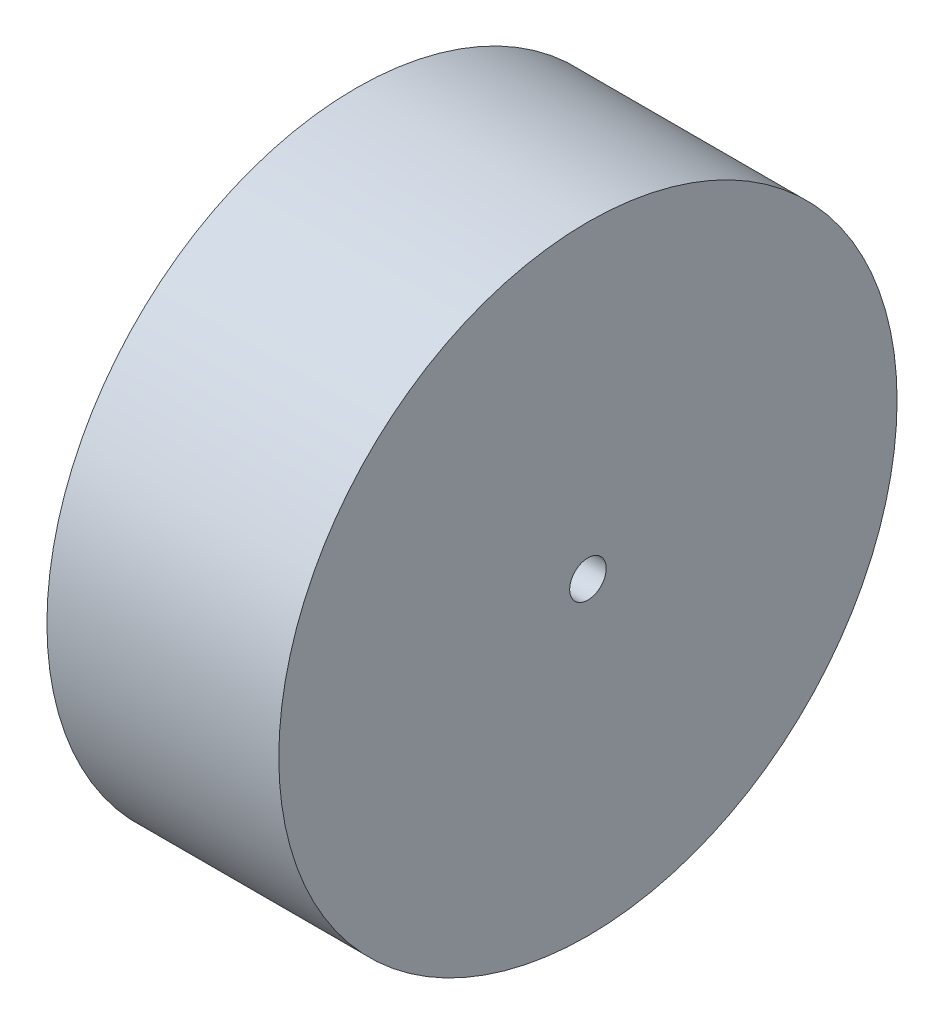
ISO-10303-21;
HEADER;
FILE_DESCRIPTION(('STEP AP214'),'2;1');
FILE_NAME('part.step','',(''),(''),'','','');
FILE_SCHEMA(('AUTOMOTIVE_DESIGN { 1 0 10303 214 1 1 1 1 }'));
ENDSEC;
DATA;
#1=APPLICATION_CONTEXT('core data for automotive mechanical design processes');
#2=APPLICATION_PROTOCOL_DEFINITION('international standard','automotive_design',2000,#1);
#3=PRODUCT_CONTEXT('',#1,'mechanical');
#4=PRODUCT('Part','Part','',(#3));
#5=PRODUCT_RELATED_PRODUCT_CATEGORY('part','',(#4));
#6=PRODUCT_DEFINITION_FORMATION('','',#4);
#7=PRODUCT_DEFINITION_CONTEXT('part definition',#1,'design');
#8=PRODUCT_DEFINITION('design','',#6,#7);
#9=PRODUCT_DEFINITION_SHAPE('','',#8);
#10=(LENGTH_UNIT() NAMED_UNIT(*) SI_UNIT(.MILLI.,.METRE.));
#11=(NAMED_UNIT(*) PLANE_ANGLE_UNIT() SI_UNIT($,.RADIAN.));
#12=(NAMED_UNIT(*) SI_UNIT($,.STERADIAN.) SOLID_ANGLE_UNIT());
#13=UNCERTAINTY_MEASURE_WITH_UNIT(LENGTH_MEASURE(1.E-05),#10,'distance_accuracy_value','');
#14=(GEOMETRIC_REPRESENTATION_CONTEXT(3) GLOBAL_UNCERTAINTY_ASSIGNED_CONTEXT((#13)) GLOBAL_UNIT_ASSIGNED_CONTEXT((#10,
#11,#12)) REPRESENTATION_CONTEXT('',''));
#15=CARTESIAN_POINT('',(0.,0.,0.));
#16=DIRECTION('',(0.,0.,1.));
#17=DIRECTION('',(1.,0.,0.));
#18=AXIS2_PLACEMENT_3D('',#15,#16,#17);
#19=CARTESIAN_POINT('',(19.05,0.,0.));
#20=DIRECTION('',(1.,0.,0.));
#21=DIRECTION('',(0.,0.,-1.));
#22=AXIS2_PLACEMENT_3D('',#19,#20,#21);
#23=PLANE('',#22);
#24=CARTESIAN_POINT('',(19.05,0.,0.));
#25=DIRECTION('',(1.,0.,0.));
#26=DIRECTION('',(0.,0.,-1.));
#27=AXIS2_PLACEMENT_3D('',#24,#25,#26);
#28=CIRCLE('',#27,25.4);
#29=CARTESIAN_POINT('',(19.05,0.,25.4));
#30=VERTEX_POINT('',#29);
#31=EDGE_CURVE('E10',#30,#30,#28,.T.);
#32=ORIENTED_EDGE('',*,*,#31,.T.);
#33=EDGE_LOOP('',(#32));
#34=FACE_BOUND('',#33,.T.);
#35=CARTESIAN_POINT('',(19.05,0.,0.));
#36=DIRECTION('',(1.,0.,0.));
#37=DIRECTION('',(0.,0.,-1.));
#38=AXIS2_PLACEMENT_3D('',#35,#36,#37);
#39=CIRCLE('',#38,1.5);
#40=CARTESIAN_POINT('',(19.05,0.,1.5));
#41=VERTEX_POINT('',#40);
#42=EDGE_CURVE('E54',#41,#41,#39,.T.);
#43=ORIENTED_EDGE('',*,*,#42,.F.);
#44=EDGE_LOOP('',(#43));
#45=FACE_BOUND('',#44,.T.);
#46=ADVANCED_FACE('F41',(#34,#45),#23,.T.);
#47=CARTESIAN_POINT('',(0.,0.,0.));
#48=DIRECTION('',(1.,0.,0.));
#49=DIRECTION('',(0.,0.,-1.));
#50=AXIS2_PLACEMENT_3D('',#47,#48,#49);
#51=PLANE('',#50);
#52=CARTESIAN_POINT('',(0.,0.,0.));
#53=DIRECTION('',(1.,0.,0.));
#54=DIRECTION('',(0.,0.,-1.));
#55=AXIS2_PLACEMENT_3D('',#52,#53,#54);
#56=CIRCLE('',#55,25.4);
#57=CARTESIAN_POINT('',(0.,0.,25.4));
#58=VERTEX_POINT('',#57);
#59=EDGE_CURVE('E45',#58,#58,#56,.T.);
#60=ORIENTED_EDGE('',*,*,#59,.F.);
#61=EDGE_LOOP('',(#60));
#62=FACE_BOUND('',#61,.T.);
#63=CARTESIAN_POINT('',(0.,0.,0.));
#64=DIRECTION('',(1.,0.,0.));
#65=DIRECTION('',(0.,0.,-1.));
#66=AXIS2_PLACEMENT_3D('',#63,#64,#65);
#67=CIRCLE('',#66,1.5);
#68=CARTESIAN_POINT('',(0.,0.,1.5));
#69=VERTEX_POINT('',#68);
#70=EDGE_CURVE('E56',#69,#69,#67,.T.);
#71=ORIENTED_EDGE('',*,*,#70,.T.);
#72=EDGE_LOOP('',(#71));
#73=FACE_BOUND('',#72,.T.);
#74=ADVANCED_FACE('F68',(#62,#73),#51,.F.);
#75=CARTESIAN_POINT('',(19.05,0.,0.));
#76=DIRECTION('',(-1.,0.,0.));
#77=DIRECTION('',(0.,0.,1.));
#78=AXIS2_PLACEMENT_3D('',#75,#76,#77);
#79=CYLINDRICAL_SURFACE('',#78,25.4);
#80=CARTESIAN_POINT('',(19.05,0.,25.4));
#81=CARTESIAN_POINT('',(18.8515625,0.,25.4));
#82=CARTESIAN_POINT('',(18.653125,0.,25.4));
#83=CARTESIAN_POINT('',(18.25625,0.,25.4));
#84=CARTESIAN_POINT('',(18.0578125,0.,25.4));
#85=CARTESIAN_POINT('',(17.6609375,0.,25.4));
#86=CARTESIAN_POINT('',(17.4625,0.,25.4));
#87=CARTESIAN_POINT('',(17.065625,0.,25.4));
#88=CARTESIAN_POINT('',(16.8671875,0.,25.4));
#89=CARTESIAN_POINT('',(16.4703125,0.,25.4));
#90=CARTESIAN_POINT('',(16.271875,0.,25.4));
#91=CARTESIAN_POINT('',(15.875,0.,25.4));
#92=CARTESIAN_POINT('',(15.6765625,0.,25.4));
#93=CARTESIAN_POINT('',(15.2796875,0.,25.4));
#94=CARTESIAN_POINT('',(15.08125,0.,25.4));
#95=CARTESIAN_POINT('',(14.684375,0.,25.4));
#96=CARTESIAN_POINT('',(14.4859375,0.,25.4));
#97=CARTESIAN_POINT('',(14.0890625,0.,25.4));
#98=CARTESIAN_POINT('',(13.890625,0.,25.4));
#99=CARTESIAN_POINT('',(13.49375,0.,25.4));
#100=CARTESIAN_POINT('',(13.2953125,0.,25.4));
#101=CARTESIAN_POINT('',(12.8984375,0.,25.4));
#102=CARTESIAN_POINT('',(12.7,0.,25.4));
#103=CARTESIAN_POINT('',(12.303125,0.,25.4));
#104=CARTESIAN_POINT('',(12.1046875,0.,25.4));
#105=CARTESIAN_POINT('',(11.7078125,0.,25.4));
#106=CARTESIAN_POINT('',(11.509375,0.,25.4));
#107=CARTESIAN_POINT('',(11.1125,0.,25.4));
#108=CARTESIAN_POINT('',(10.9140625,0.,25.4));
#109=CARTESIAN_POINT('',(10.5171875,0.,25.4));
#110=CARTESIAN_POINT('',(10.31875,0.,25.4));
#111=CARTESIAN_POINT('',(9.921875,0.,25.4));
#112=CARTESIAN_POINT('',(9.7234375,0.,25.4));
#113=CARTESIAN_POINT('',(9.3265625,0.,25.4));
#114=CARTESIAN_POINT('',(9.128125,0.,25.4));
#115=CARTESIAN_POINT('',(8.73125,0.,25.4));
#116=CARTESIAN_POINT('',(8.5328125,0.,25.4));
#117=CARTESIAN_POINT('',(8.1359375,0.,25.4));
#118=CARTESIAN_POINT('',(7.9375,0.,25.4));
#119=CARTESIAN_POINT('',(7.540625,0.,25.4));
#120=CARTESIAN_POINT('',(7.3421875,0.,25.4));
#121=CARTESIAN_POINT('',(6.9453125,0.,25.4));
#122=CARTESIAN_POINT('',(6.746875,0.,25.4));
#123=CARTESIAN_POINT('',(6.35,0.,25.4));
#124=CARTESIAN_POINT('',(6.1515625,0.,25.4));
#125=CARTESIAN_POINT('',(5.7546875,0.,25.4));
#126=CARTESIAN_POINT('',(5.55625,0.,25.4));
#127=CARTESIAN_POINT('',(5.159375,0.,25.4));
#128=CARTESIAN_POINT('',(4.9609375,0.,25.4));
#129=CARTESIAN_POINT('',(4.5640625,0.,25.4));
#130=CARTESIAN_POINT('',(4.365625,0.,25.4));
#131=CARTESIAN_POINT('',(3.96875,0.,25.4));
#132=CARTESIAN_POINT('',(3.7703125,0.,25.4));
#133=CARTESIAN_POINT('',(3.3734375,0.,25.4));
#134=CARTESIAN_POINT('',(3.175,0.,25.4));
#135=CARTESIAN_POINT('',(2.778125,0.,25.4));
#136=CARTESIAN_POINT('',(2.5796875,0.,25.4));
#137=CARTESIAN_POINT('',(2.1828125,0.,25.4));
#138=CARTESIAN_POINT('',(1.984375,0.,25.4));
#139=CARTESIAN_POINT('',(1.5875,0.,25.4));
#140=CARTESIAN_POINT('',(1.3890625,0.,25.4));
#141=CARTESIAN_POINT('',(0.992187500000001,0.,25.4));
#142=CARTESIAN_POINT('',(0.793750000000001,0.,25.4));
#143=CARTESIAN_POINT('',(0.396875,0.,25.4));
#144=CARTESIAN_POINT('',(0.1984375,0.,25.4));
#145=CARTESIAN_POINT('',(0.,0.,25.4));
#146=B_SPLINE_CURVE_WITH_KNOTS('',3,(#80,#81,#82,#83,#84,#85,#86,#87,#88,#89,#90,#91,#92,#93,
#94,#95,#96,#97,#98,#99,#100,#101,#102,#103,#104,#105,#106,#107,#108,#109,#110,#111,#112,#113,
#114,#115,#116,#117,#118,#119,#120,#121,#122,#123,#124,#125,#126,#127,#128,#129,#130,#131,#132,
#133,#134,#135,#136,#137,#138,#139,#140,#141,#142,#143,#144,#145),.UNSPECIFIED.,.F.,.F.,(4,2,2,
2,2,2,2,2,2,2,2,2,2,2,2,2,2,2,2,2,2,2,2,2,2,2,2,2,2,2,2,2,4),(0.,0.5953125,1.190625,1.7859375,
2.38125,2.9765625,3.571875,4.1671875,4.7625,5.3578125,5.953125,6.5484375,7.14375,7.7390625,
8.334375,8.9296875,9.525,10.1203125,10.715625,11.3109375,11.90625,12.5015625,13.096875,
13.6921875,14.2875,14.8828125,15.478125,16.0734375,16.66875,17.2640625,17.859375,18.4546875,
19.05),.UNSPECIFIED.);
#147=EDGE_CURVE('BSEAM43',#30,#58,#146,.T.);
#148=ORIENTED_EDGE('',*,*,#31,.F.);
#149=ORIENTED_EDGE('',*,*,#59,.T.);
#150=ORIENTED_EDGE('',*,*,#147,.T.);
#151=ORIENTED_EDGE('',*,*,#147,.F.);
#152=EDGE_LOOP('',(#148,#150,#149,#151));
#153=FACE_BOUND('',#152,.T.);
#154=ADVANCED_FACE('F43',(#153),#79,.T.);
#155=CARTESIAN_POINT('',(19.05,0.,0.));
#156=DIRECTION('',(-1.,0.,0.));
#157=DIRECTION('',(0.,0.,1.));
#158=AXIS2_PLACEMENT_3D('',#155,#156,#157);
#159=CYLINDRICAL_SURFACE('',#158,1.5);
#160=CARTESIAN_POINT('',(19.05,0.,1.5));
#161=CARTESIAN_POINT('',(18.8515625,0.,1.5));
#162=CARTESIAN_POINT('',(18.653125,0.,1.5));
#163=CARTESIAN_POINT('',(18.25625,0.,1.5));
#164=CARTESIAN_POINT('',(18.0578125,0.,1.5));
#165=CARTESIAN_POINT('',(17.6609375,0.,1.5));
#166=CARTESIAN_POINT('',(17.4625,0.,1.5));
#167=CARTESIAN_POINT('',(17.065625,0.,1.5));
#168=CARTESIAN_POINT('',(16.8671875,0.,1.5));
#169=CARTESIAN_POINT('',(16.4703125,0.,1.5));
#170=CARTESIAN_POINT('',(16.271875,0.,1.5));
#171=CARTESIAN_POINT('',(15.875,0.,1.5));
#172=CARTESIAN_POINT('',(15.6765625,0.,1.5));
#173=CARTESIAN_POINT('',(15.2796875,0.,1.5));
#174=CARTESIAN_POINT('',(15.08125,0.,1.5));
#175=CARTESIAN_POINT('',(14.684375,0.,1.5));
#176=CARTESIAN_POINT('',(14.4859375,0.,1.5));
#177=CARTESIAN_POINT('',(14.0890625,0.,1.5));
#178=CARTESIAN_POINT('',(13.890625,0.,1.5));
#179=CARTESIAN_POINT('',(13.49375,0.,1.5));
#180=CARTESIAN_POINT('',(13.2953125,0.,1.5));
#181=CARTESIAN_POINT('',(12.8984375,0.,1.5));
#182=CARTESIAN_POINT('',(12.7,0.,1.5));
#183=CARTESIAN_POINT('',(12.303125,0.,1.5));
#184=CARTESIAN_POINT('',(12.1046875,0.,1.5));
#185=CARTESIAN_POINT('',(11.7078125,0.,1.5));
#186=CARTESIAN_POINT('',(11.509375,0.,1.5));
#187=CARTESIAN_POINT('',(11.1125,0.,1.5));
#188=CARTESIAN_POINT('',(10.9140625,0.,1.5));
#189=CARTESIAN_POINT('',(10.5171875,0.,1.5));
#190=CARTESIAN_POINT('',(10.31875,0.,1.5));
#191=CARTESIAN_POINT('',(9.921875,0.,1.5));
#192=CARTESIAN_POINT('',(9.7234375,0.,1.5));
#193=CARTESIAN_POINT('',(9.3265625,0.,1.5));
#194=CARTESIAN_POINT('',(9.128125,0.,1.5));
#195=CARTESIAN_POINT('',(8.73125,0.,1.5));
#196=CARTESIAN_POINT('',(8.5328125,0.,1.5));
#197=CARTESIAN_POINT('',(8.1359375,0.,1.5));
#198=CARTESIAN_POINT('',(7.9375,0.,1.5));
#199=CARTESIAN_POINT('',(7.540625,0.,1.5));
#200=CARTESIAN_POINT('',(7.3421875,0.,1.5));
#201=CARTESIAN_POINT('',(6.9453125,0.,1.5));
#202=CARTESIAN_POINT('',(6.746875,0.,1.5));
#203=CARTESIAN_POINT('',(6.35,0.,1.5));
#204=CARTESIAN_POINT('',(6.1515625,0.,1.5));
#205=CARTESIAN_POINT('',(5.7546875,0.,1.5));
#206=CARTESIAN_POINT('',(5.55625,0.,1.5));
#207=CARTESIAN_POINT('',(5.159375,0.,1.5));
#208=CARTESIAN_POINT('',(4.9609375,0.,1.5));
#209=CARTESIAN_POINT('',(4.5640625,0.,1.5));
#210=CARTESIAN_POINT('',(4.365625,0.,1.5));
#211=CARTESIAN_POINT('',(3.96875,0.,1.5));
#212=CARTESIAN_POINT('',(3.7703125,0.,1.5));
#213=CARTESIAN_POINT('',(3.3734375,0.,1.5));
#214=CARTESIAN_POINT('',(3.175,0.,1.5));
#215=CARTESIAN_POINT('',(2.778125,0.,1.5));
#216=CARTESIAN_POINT('',(2.5796875,0.,1.5));
#217=CARTESIAN_POINT('',(2.1828125,0.,1.5));
#218=CARTESIAN_POINT('',(1.984375,0.,1.5));
#219=CARTESIAN_POINT('',(1.5875,0.,1.5));
#220=CARTESIAN_POINT('',(1.3890625,0.,1.5));
#221=CARTESIAN_POINT('',(0.992187500000001,0.,1.5));
#222=CARTESIAN_POINT('',(0.793750000000001,0.,1.5));
#223=CARTESIAN_POINT('',(0.396875,0.,1.5));
#224=CARTESIAN_POINT('',(0.1984375,0.,1.5));
#225=CARTESIAN_POINT('',(0.,0.,1.5));
#226=B_SPLINE_CURVE_WITH_KNOTS('',3,(#160,#161,#162,#163,#164,#165,#166,#167,#168,#169,#170,
#171,#172,#173,#174,#175,#176,#177,#178,#179,#180,#181,#182,#183,#184,#185,#186,#187,#188,#189,
#190,#191,#192,#193,#194,#195,#196,#197,#198,#199,#200,#201,#202,#203,#204,#205,#206,#207,#208,
#209,#210,#211,#212,#213,#214,#215,#216,#217,#218,#219,#220,#221,#222,#223,#224,#225),
.UNSPECIFIED.,.F.,.F.,(4,2,2,2,2,2,2,2,2,2,2,2,2,2,2,2,2,2,2,2,2,2,2,2,2,2,2,2,2,2,2,2,4),(0.,
0.5953125,1.190625,1.7859375,2.38125,2.9765625,3.571875,4.1671875,4.7625,5.3578125,5.953125,
6.5484375,7.14375,7.7390625,8.334375,8.9296875,9.525,10.1203125,10.715625,11.3109375,11.90625,
12.5015625,13.096875,13.6921875,14.2875,14.8828125,15.478125,16.0734375,16.66875,17.2640625,
17.859375,18.4546875,19.05),.UNSPECIFIED.);
#227=EDGE_CURVE('BSEAM64',#41,#69,#226,.T.);
#228=ORIENTED_EDGE('',*,*,#42,.T.);
#229=ORIENTED_EDGE('',*,*,#70,.F.);
#230=ORIENTED_EDGE('',*,*,#227,.T.);
#231=ORIENTED_EDGE('',*,*,#227,.F.);
#232=EDGE_LOOP('',(#228,#230,#229,#231));
#233=FACE_BOUND('',#232,.T.);
#234=ADVANCED_FACE('F64',(#233),#159,.F.);
#235=CLOSED_SHELL('',(#46,#74,#154,#234));
#236=MANIFOLD_SOLID_BREP('B2',#235);
#237=ADVANCED_BREP_SHAPE_REPRESENTATION('',(#18,#236),#14);
#238=SHAPE_DEFINITION_REPRESENTATION(#9,#237);
ENDSEC;
END-ISO-10303-21;
